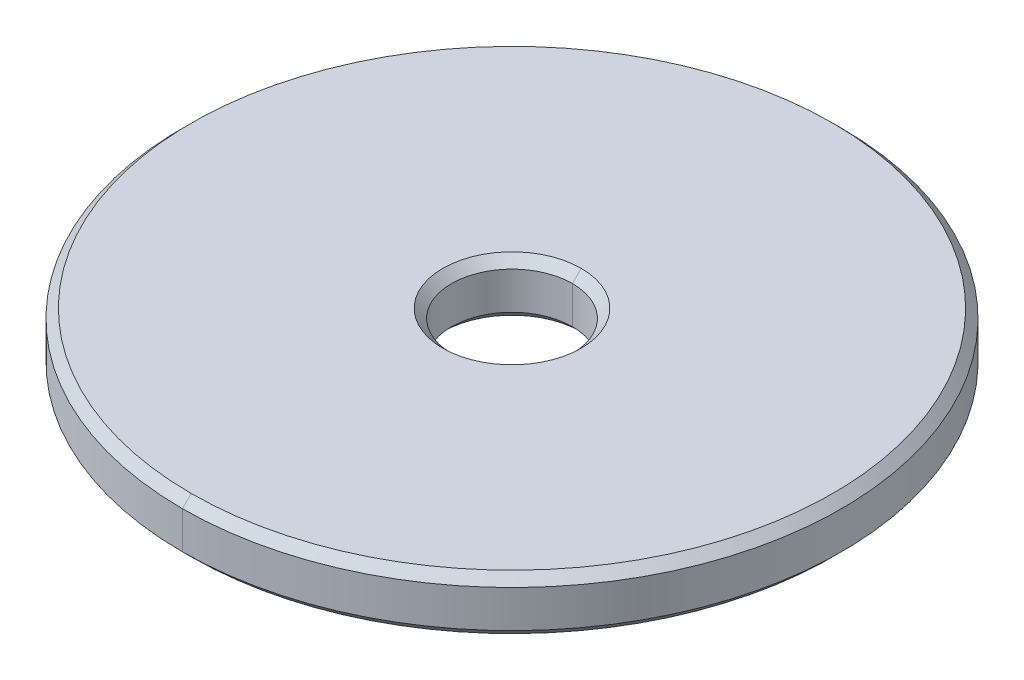
ISO-10303-21;
HEADER;
FILE_DESCRIPTION(('STEP AP214'),'2;1');
FILE_NAME('part.step','',(''),(''),'','','');
FILE_SCHEMA(('AUTOMOTIVE_DESIGN { 1 0 10303 214 1 1 1 1 }'));
ENDSEC;
DATA;
#1=APPLICATION_CONTEXT('core data for automotive mechanical design processes');
#2=APPLICATION_PROTOCOL_DEFINITION('international standard','automotive_design',2000,#1);
#3=PRODUCT_CONTEXT('',#1,'mechanical');
#4=PRODUCT('Part','Part','',(#3));
#5=PRODUCT_RELATED_PRODUCT_CATEGORY('part','',(#4));
#6=PRODUCT_DEFINITION_FORMATION('','',#4);
#7=PRODUCT_DEFINITION_CONTEXT('part definition',#1,'design');
#8=PRODUCT_DEFINITION('design','',#6,#7);
#9=PRODUCT_DEFINITION_SHAPE('','',#8);
#10=(LENGTH_UNIT() NAMED_UNIT(*) SI_UNIT(.MILLI.,.METRE.));
#11=(NAMED_UNIT(*) PLANE_ANGLE_UNIT() SI_UNIT($,.RADIAN.));
#12=(NAMED_UNIT(*) SI_UNIT($,.STERADIAN.) SOLID_ANGLE_UNIT());
#13=UNCERTAINTY_MEASURE_WITH_UNIT(LENGTH_MEASURE(1.E-05),#10,'distance_accuracy_value','');
#14=(GEOMETRIC_REPRESENTATION_CONTEXT(3) GLOBAL_UNCERTAINTY_ASSIGNED_CONTEXT((#13)) GLOBAL_UNIT_ASSIGNED_CONTEXT((#10,
#11,#12)) REPRESENTATION_CONTEXT('',''));
#15=CARTESIAN_POINT('',(0.,0.,0.));
#16=DIRECTION('',(0.,0.,1.));
#17=DIRECTION('',(1.,0.,0.));
#18=AXIS2_PLACEMENT_3D('',#15,#16,#17);
#19=CARTESIAN_POINT('',(0.,2.62120069378255,0.));
#20=DIRECTION('',(0.,1.,0.));
#21=DIRECTION('',(0.,0.,1.));
#22=AXIS2_PLACEMENT_3D('',#19,#20,#21);
#23=CONICAL_SURFACE('',#22,3.44670069378255,0.78539816339745);
#24=CARTESIAN_POINT('',(0.,2.667,0.));
#25=DIRECTION('',(0.,-1.,0.));
#26=DIRECTION('',(0.,0.,-1.));
#27=AXIS2_PLACEMENT_3D('',#24,#25,#26);
#28=CIRCLE('',#27,3.4925);
#29=CARTESIAN_POINT('',(0.,2.667,-3.4925));
#30=VERTEX_POINT('',#29);
#31=CARTESIAN_POINT('',(0.,2.667,3.4925));
#32=VERTEX_POINT('',#31);
#33=EDGE_CURVE('E20',#30,#32,#28,.T.);
#34=ORIENTED_EDGE('',*,*,#33,.T.);
#35=DIRECTION('',(0.,-0.707106781186546,-0.707106781186549));
#36=VECTOR('',#35,1.);
#37=CARTESIAN_POINT('',(0.,3.175,4.0005));
#38=LINE('',#37,#36);
#39=CARTESIAN_POINT('',(0.,3.175,4.0005));
#40=VERTEX_POINT('',#39);
#41=EDGE_CURVE('E128',#40,#32,#38,.T.);
#42=ORIENTED_EDGE('',*,*,#41,.F.);
#43=CARTESIAN_POINT('',(0.,3.175,0.));
#44=DIRECTION('',(0.,-1.,0.));
#45=DIRECTION('',(0.,0.,-1.));
#46=AXIS2_PLACEMENT_3D('',#43,#44,#45);
#47=CIRCLE('',#46,4.0005);
#48=CARTESIAN_POINT('',(0.,3.175,-4.0005));
#49=VERTEX_POINT('',#48);
#50=EDGE_CURVE('E118',#49,#40,#47,.T.);
#51=ORIENTED_EDGE('',*,*,#50,.F.);
#52=DIRECTION('',(0.,-0.707106781186546,0.707106781186549));
#53=VECTOR('',#52,1.);
#54=CARTESIAN_POINT('',(0.,3.175,-4.0005));
#55=LINE('',#54,#53);
#56=EDGE_CURVE('E132',#49,#30,#55,.T.);
#57=ORIENTED_EDGE('',*,*,#56,.T.);
#58=EDGE_LOOP('',(#34,#42,#51,#57));
#59=FACE_BOUND('',#58,.T.);
#60=ADVANCED_FACE('F17',(#59),#23,.F.);
#61=CARTESIAN_POINT('',(0.,-0.0457993062174637,0.));
#62=DIRECTION('',(0.,1.,0.));
#63=DIRECTION('',(0.,0.,1.));
#64=AXIS2_PLACEMENT_3D('',#61,#62,#63);
#65=CONICAL_SURFACE('',#64,18.4962006937825,0.785398163397452);
#66=DIRECTION('',(0.,-0.707106781186545,0.70710678118655));
#67=VECTOR('',#66,1.);
#68=CARTESIAN_POINT('',(0.,0.508000000000008,-19.05));
#69=LINE('',#68,#67);
#70=CARTESIAN_POINT('',(0.,0.508000000000003,-19.05));
#71=VERTEX_POINT('',#70);
#72=CARTESIAN_POINT('',(0.,0.,-18.542));
#73=VERTEX_POINT('',#72);
#74=EDGE_CURVE('E26',#71,#73,#69,.T.);
#75=ORIENTED_EDGE('',*,*,#74,.F.);
#76=CARTESIAN_POINT('',(0.,0.508000000000019,0.));
#77=DIRECTION('',(0.,-1.,0.));
#78=DIRECTION('',(0.,0.,-1.));
#79=AXIS2_PLACEMENT_3D('',#76,#77,#78);
#80=CIRCLE('',#79,19.05);
#81=CARTESIAN_POINT('',(0.,0.508000000000003,19.05));
#82=VERTEX_POINT('',#81);
#83=EDGE_CURVE('E33',#71,#82,#80,.T.);
#84=ORIENTED_EDGE('',*,*,#83,.T.);
#85=DIRECTION('',(0.,-0.707106781186545,-0.70710678118655));
#86=VECTOR('',#85,1.);
#87=CARTESIAN_POINT('',(0.,0.508000000000008,19.05));
#88=LINE('',#87,#86);
#89=CARTESIAN_POINT('',(0.,0.,18.542));
#90=VERTEX_POINT('',#89);
#91=EDGE_CURVE('E11',#82,#90,#88,.T.);
#92=ORIENTED_EDGE('',*,*,#91,.T.);
#93=CARTESIAN_POINT('',(0.,0.,0.));
#94=DIRECTION('',(0.,-1.,0.));
#95=DIRECTION('',(0.,0.,-1.));
#96=AXIS2_PLACEMENT_3D('',#93,#94,#95);
#97=CIRCLE('',#96,18.542);
#98=EDGE_CURVE('E161',#73,#90,#97,.T.);
#99=ORIENTED_EDGE('',*,*,#98,.F.);
#100=EDGE_LOOP('',(#75,#84,#92,#99));
#101=FACE_BOUND('',#100,.T.);
#102=ADVANCED_FACE('F206',(#101),#65,.T.);
#103=CARTESIAN_POINT('',(0.,-0.0457993062174637,0.));
#104=DIRECTION('',(0.,1.,0.));
#105=DIRECTION('',(0.,0.,1.));
#106=AXIS2_PLACEMENT_3D('',#103,#104,#105);
#107=CONICAL_SURFACE('',#106,18.4962006937825,0.785398163397452);
#108=CARTESIAN_POINT('',(0.,0.,0.));
#109=DIRECTION('',(0.,-1.,0.));
#110=DIRECTION('',(0.,0.,1.));
#111=AXIS2_PLACEMENT_3D('',#108,#109,#110);
#112=CIRCLE('',#111,18.542);
#113=EDGE_CURVE('E157',#90,#73,#112,.T.);
#114=ORIENTED_EDGE('',*,*,#113,.F.);
#115=ORIENTED_EDGE('',*,*,#91,.F.);
#116=CARTESIAN_POINT('',(0.,0.508000000000019,0.));
#117=DIRECTION('',(0.,-1.,0.));
#118=DIRECTION('',(0.,0.,1.));
#119=AXIS2_PLACEMENT_3D('',#116,#117,#118);
#120=CIRCLE('',#119,19.05);
#121=EDGE_CURVE('E171',#82,#71,#120,.T.);
#122=ORIENTED_EDGE('',*,*,#121,.T.);
#123=ORIENTED_EDGE('',*,*,#74,.T.);
#124=EDGE_LOOP('',(#114,#115,#122,#123));
#125=FACE_BOUND('',#124,.T.);
#126=ADVANCED_FACE('F210',(#125),#107,.T.);
#127=CARTESIAN_POINT('',(0.,0.,0.));
#128=DIRECTION('',(0.,1.,0.));
#129=DIRECTION('',(0.,0.,1.));
#130=AXIS2_PLACEMENT_3D('',#127,#128,#129);
#131=PLANE('',#130);
#132=CARTESIAN_POINT('',(0.,0.,0.));
#133=DIRECTION('',(0.,1.,0.));
#134=DIRECTION('',(0.,0.,1.));
#135=AXIS2_PLACEMENT_3D('',#132,#133,#134);
#136=CIRCLE('',#135,4.0005);
#137=CARTESIAN_POINT('',(0.,0.,4.0005));
#138=VERTEX_POINT('',#137);
#139=CARTESIAN_POINT('',(0.,0.,-4.0005));
#140=VERTEX_POINT('',#139);
#141=EDGE_CURVE('E147',#138,#140,#136,.T.);
#142=ORIENTED_EDGE('',*,*,#141,.T.);
#143=CARTESIAN_POINT('',(0.,0.,0.));
#144=DIRECTION('',(0.,1.,0.));
#145=DIRECTION('',(0.,0.,-1.));
#146=AXIS2_PLACEMENT_3D('',#143,#144,#145);
#147=CIRCLE('',#146,4.0005);
#148=EDGE_CURVE('E156',#140,#138,#147,.T.);
#149=ORIENTED_EDGE('',*,*,#148,.T.);
#150=EDGE_LOOP('',(#142,#149));
#151=FACE_BOUND('',#150,.T.);
#152=ORIENTED_EDGE('',*,*,#98,.T.);
#153=ORIENTED_EDGE('',*,*,#113,.T.);
#154=EDGE_LOOP('',(#152,#153));
#155=FACE_BOUND('',#154,.T.);
#156=ADVANCED_FACE('F214',(#151,#155),#131,.F.);
#157=CARTESIAN_POINT('',(0.,0.553799306217448,0.));
#158=DIRECTION('',(0.,-1.,0.));
#159=DIRECTION('',(0.,0.,-1.));
#160=AXIS2_PLACEMENT_3D('',#157,#158,#159);
#161=CONICAL_SURFACE('',#160,3.44670069378255,0.785398163397454);
#162=DIRECTION('',(0.,0.707106781186544,-0.707106781186551));
#163=VECTOR('',#162,1.);
#164=CARTESIAN_POINT('',(0.,0.,4.0005));
#165=LINE('',#164,#163);
#166=CARTESIAN_POINT('',(0.,0.507999999999998,3.4925));
#167=VERTEX_POINT('',#166);
#168=EDGE_CURVE('E143',#138,#167,#165,.T.);
#169=ORIENTED_EDGE('',*,*,#168,.F.);
#170=ORIENTED_EDGE('',*,*,#148,.F.);
#171=DIRECTION('',(0.,0.707106781186544,0.707106781186551));
#172=VECTOR('',#171,1.);
#173=CARTESIAN_POINT('',(0.,0.,-4.0005));
#174=LINE('',#173,#172);
#175=CARTESIAN_POINT('',(0.,0.507999999999998,-3.4925));
#176=VERTEX_POINT('',#175);
#177=EDGE_CURVE('E153',#140,#176,#174,.T.);
#178=ORIENTED_EDGE('',*,*,#177,.T.);
#179=CARTESIAN_POINT('',(0.,0.507999999999995,0.));
#180=DIRECTION('',(0.,1.,0.));
#181=DIRECTION('',(0.,0.,-1.));
#182=AXIS2_PLACEMENT_3D('',#179,#180,#181);
#183=CIRCLE('',#182,3.4925);
#184=EDGE_CURVE('E137',#176,#167,#183,.T.);
#185=ORIENTED_EDGE('',*,*,#184,.T.);
#186=EDGE_LOOP('',(#169,#170,#178,#185));
#187=FACE_BOUND('',#186,.T.);
#188=ADVANCED_FACE('F220',(#187),#161,.F.);
#189=CARTESIAN_POINT('',(0.,0.553799306217448,0.));
#190=DIRECTION('',(0.,-1.,0.));
#191=DIRECTION('',(0.,0.,-1.));
#192=AXIS2_PLACEMENT_3D('',#189,#190,#191);
#193=CONICAL_SURFACE('',#192,3.44670069378255,0.785398163397454);
#194=CARTESIAN_POINT('',(0.,0.507999999999995,0.));
#195=DIRECTION('',(0.,1.,0.));
#196=DIRECTION('',(0.,0.,1.));
#197=AXIS2_PLACEMENT_3D('',#194,#195,#196);
#198=CIRCLE('',#197,3.4925);
#199=EDGE_CURVE('E142',#167,#176,#198,.T.);
#200=ORIENTED_EDGE('',*,*,#199,.T.);
#201=ORIENTED_EDGE('',*,*,#177,.F.);
#202=ORIENTED_EDGE('',*,*,#141,.F.);
#203=ORIENTED_EDGE('',*,*,#168,.T.);
#204=EDGE_LOOP('',(#200,#201,#202,#203));
#205=FACE_BOUND('',#204,.T.);
#206=ADVANCED_FACE('F224',(#205),#193,.F.);
#207=CARTESIAN_POINT('',(0.,3.175,0.));
#208=DIRECTION('',(0.,-1.,0.));
#209=DIRECTION('',(0.,0.,-1.));
#210=AXIS2_PLACEMENT_3D('',#207,#208,#209);
#211=CYLINDRICAL_SURFACE('',#210,3.4925);
#212=ORIENTED_EDGE('',*,*,#33,.F.);
#213=DIRECTION('',(0.,1.,0.));
#214=VECTOR('',#213,1.);
#215=CARTESIAN_POINT('',(0.,0.508,-3.4925));
#216=LINE('',#215,#214);
#217=EDGE_CURVE('E133',#176,#30,#216,.T.);
#218=ORIENTED_EDGE('',*,*,#217,.F.);
#219=ORIENTED_EDGE('',*,*,#199,.F.);
#220=DIRECTION('',(0.,1.,0.));
#221=VECTOR('',#220,1.);
#222=CARTESIAN_POINT('',(0.,0.508,3.4925));
#223=LINE('',#222,#221);
#224=EDGE_CURVE('E138',#167,#32,#223,.T.);
#225=ORIENTED_EDGE('',*,*,#224,.T.);
#226=EDGE_LOOP('',(#212,#218,#219,#225));
#227=FACE_BOUND('',#226,.T.);
#228=ADVANCED_FACE('F185',(#227),#211,.F.);
#229=CARTESIAN_POINT('',(0.,3.175,0.));
#230=DIRECTION('',(0.,-1.,0.));
#231=DIRECTION('',(0.,0.,-1.));
#232=AXIS2_PLACEMENT_3D('',#229,#230,#231);
#233=CYLINDRICAL_SURFACE('',#232,3.4925);
#234=ORIENTED_EDGE('',*,*,#224,.F.);
#235=ORIENTED_EDGE('',*,*,#184,.F.);
#236=ORIENTED_EDGE('',*,*,#217,.T.);
#237=CARTESIAN_POINT('',(0.,2.667,0.));
#238=DIRECTION('',(0.,-1.,0.));
#239=DIRECTION('',(0.,0.,1.));
#240=AXIS2_PLACEMENT_3D('',#237,#238,#239);
#241=CIRCLE('',#240,3.4925);
#242=EDGE_CURVE('E121',#32,#30,#241,.T.);
#243=ORIENTED_EDGE('',*,*,#242,.F.);
#244=EDGE_LOOP('',(#234,#235,#236,#243));
#245=FACE_BOUND('',#244,.T.);
#246=ADVANCED_FACE('F192',(#245),#233,.F.);
#247=CARTESIAN_POINT('',(0.,2.62120069378255,0.));
#248=DIRECTION('',(0.,1.,0.));
#249=DIRECTION('',(0.,0.,1.));
#250=AXIS2_PLACEMENT_3D('',#247,#248,#249);
#251=CONICAL_SURFACE('',#250,3.44670069378255,0.78539816339745);
#252=ORIENTED_EDGE('',*,*,#56,.F.);
#253=CARTESIAN_POINT('',(0.,3.175,0.));
#254=DIRECTION('',(0.,-1.,0.));
#255=DIRECTION('',(0.,0.,1.));
#256=AXIS2_PLACEMENT_3D('',#253,#254,#255);
#257=CIRCLE('',#256,4.0005);
#258=EDGE_CURVE('E91',#40,#49,#257,.T.);
#259=ORIENTED_EDGE('',*,*,#258,.F.);
#260=ORIENTED_EDGE('',*,*,#41,.T.);
#261=ORIENTED_EDGE('',*,*,#242,.T.);
#262=EDGE_LOOP('',(#252,#259,#260,#261));
#263=FACE_BOUND('',#262,.T.);
#264=ADVANCED_FACE('F193',(#263),#251,.F.);
#265=CARTESIAN_POINT('',(0.,3.22079930621748,0.));
#266=DIRECTION('',(0.,-1.,0.));
#267=DIRECTION('',(0.,0.,-1.));
#268=AXIS2_PLACEMENT_3D('',#265,#266,#267);
#269=CONICAL_SURFACE('',#268,18.4962006937825,0.785398163397445);
#270=CARTESIAN_POINT('',(0.,3.17500000000003,0.));
#271=DIRECTION('',(0.,1.,0.));
#272=DIRECTION('',(0.,0.,-1.));
#273=AXIS2_PLACEMENT_3D('',#270,#271,#272);
#274=CIRCLE('',#273,18.542);
#275=CARTESIAN_POINT('',(0.,3.17500000000001,-18.542));
#276=VERTEX_POINT('',#275);
#277=CARTESIAN_POINT('',(0.,3.17500000000001,18.542));
#278=VERTEX_POINT('',#277);
#279=EDGE_CURVE('E80',#276,#278,#274,.T.);
#280=ORIENTED_EDGE('',*,*,#279,.F.);
#281=DIRECTION('',(0.,0.70710678118655,0.707106781186545));
#282=VECTOR('',#281,1.);
#283=CARTESIAN_POINT('',(0.,2.66699999999999,-19.05));
#284=LINE('',#283,#282);
#285=CARTESIAN_POINT('',(0.,2.66699999999999,-19.05));
#286=VERTEX_POINT('',#285);
#287=EDGE_CURVE('E84',#286,#276,#284,.T.);
#288=ORIENTED_EDGE('',*,*,#287,.F.);
#289=CARTESIAN_POINT('',(0.,2.66699999999997,0.));
#290=DIRECTION('',(0.,1.,0.));
#291=DIRECTION('',(0.,0.,-1.));
#292=AXIS2_PLACEMENT_3D('',#289,#290,#291);
#293=CIRCLE('',#292,19.05);
#294=CARTESIAN_POINT('',(0.,2.66699999999999,19.05));
#295=VERTEX_POINT('',#294);
#296=EDGE_CURVE('E113',#286,#295,#293,.T.);
#297=ORIENTED_EDGE('',*,*,#296,.T.);
#298=DIRECTION('',(0.,0.70710678118655,-0.707106781186545));
#299=VECTOR('',#298,1.);
#300=CARTESIAN_POINT('',(0.,2.66699999999998,19.05));
#301=LINE('',#300,#299);
#302=EDGE_CURVE('E87',#295,#278,#301,.T.);
#303=ORIENTED_EDGE('',*,*,#302,.T.);
#304=EDGE_LOOP('',(#280,#288,#297,#303));
#305=FACE_BOUND('',#304,.T.);
#306=ADVANCED_FACE('F82',(#305),#269,.T.);
#307=CARTESIAN_POINT('',(0.,3.175,0.));
#308=DIRECTION('',(0.,1.,0.));
#309=DIRECTION('',(0.,0.,1.));
#310=AXIS2_PLACEMENT_3D('',#307,#308,#309);
#311=PLANE('',#310);
#312=ORIENTED_EDGE('',*,*,#50,.T.);
#313=ORIENTED_EDGE('',*,*,#258,.T.);
#314=EDGE_LOOP('',(#312,#313));
#315=FACE_BOUND('',#314,.T.);
#316=CARTESIAN_POINT('',(0.,3.17500000000003,0.));
#317=DIRECTION('',(0.,1.,0.));
#318=DIRECTION('',(0.,0.,1.));
#319=AXIS2_PLACEMENT_3D('',#316,#317,#318);
#320=CIRCLE('',#319,18.542);
#321=EDGE_CURVE('E93',#278,#276,#320,.T.);
#322=ORIENTED_EDGE('',*,*,#321,.T.);
#323=ORIENTED_EDGE('',*,*,#279,.T.);
#324=EDGE_LOOP('',(#322,#323));
#325=FACE_BOUND('',#324,.T.);
#326=ADVANCED_FACE('F94',(#315,#325),#311,.T.);
#327=CARTESIAN_POINT('',(0.,3.22079930621748,0.));
#328=DIRECTION('',(0.,-1.,0.));
#329=DIRECTION('',(0.,0.,-1.));
#330=AXIS2_PLACEMENT_3D('',#327,#328,#329);
#331=CONICAL_SURFACE('',#330,18.4962006937825,0.785398163397445);
#332=ORIENTED_EDGE('',*,*,#302,.F.);
#333=CARTESIAN_POINT('',(0.,2.667,0.));
#334=DIRECTION('',(0.,1.,0.));
#335=DIRECTION('',(0.,0.,1.));
#336=AXIS2_PLACEMENT_3D('',#333,#334,#335);
#337=CIRCLE('',#336,19.05);
#338=EDGE_CURVE('E100',#295,#286,#337,.T.);
#339=ORIENTED_EDGE('',*,*,#338,.T.);
#340=ORIENTED_EDGE('',*,*,#287,.T.);
#341=ORIENTED_EDGE('',*,*,#321,.F.);
#342=EDGE_LOOP('',(#332,#339,#340,#341));
#343=FACE_BOUND('',#342,.T.);
#344=ADVANCED_FACE('F98',(#343),#331,.T.);
#345=CARTESIAN_POINT('',(0.,3.175,0.));
#346=DIRECTION('',(0.,-1.,0.));
#347=DIRECTION('',(0.,0.,-1.));
#348=AXIS2_PLACEMENT_3D('',#345,#346,#347);
#349=CYLINDRICAL_SURFACE('',#348,19.05);
#350=DIRECTION('',(0.,1.,0.));
#351=VECTOR('',#350,1.);
#352=CARTESIAN_POINT('',(0.,0.507999999999998,19.05));
#353=LINE('',#352,#351);
#354=EDGE_CURVE('E173',#82,#295,#353,.T.);
#355=ORIENTED_EDGE('',*,*,#354,.F.);
#356=ORIENTED_EDGE('',*,*,#83,.F.);
#357=DIRECTION('',(0.,1.,0.));
#358=VECTOR('',#357,1.);
#359=CARTESIAN_POINT('',(0.,0.507999999999998,-19.05));
#360=LINE('',#359,#358);
#361=EDGE_CURVE('E110',#71,#286,#360,.T.);
#362=ORIENTED_EDGE('',*,*,#361,.T.);
#363=ORIENTED_EDGE('',*,*,#338,.F.);
#364=EDGE_LOOP('',(#355,#356,#362,#363));
#365=FACE_BOUND('',#364,.T.);
#366=ADVANCED_FACE('F202',(#365),#349,.T.);
#367=CARTESIAN_POINT('',(0.,3.175,0.));
#368=DIRECTION('',(0.,-1.,0.));
#369=DIRECTION('',(0.,0.,-1.));
#370=AXIS2_PLACEMENT_3D('',#367,#368,#369);
#371=CYLINDRICAL_SURFACE('',#370,19.05);
#372=ORIENTED_EDGE('',*,*,#296,.F.);
#373=ORIENTED_EDGE('',*,*,#361,.F.);
#374=ORIENTED_EDGE('',*,*,#121,.F.);
#375=ORIENTED_EDGE('',*,*,#354,.T.);
#376=EDGE_LOOP('',(#372,#373,#374,#375));
#377=FACE_BOUND('',#376,.T.);
#378=ADVANCED_FACE('F266',(#377),#371,.T.);
#379=CLOSED_SHELL('',(#60,#102,#126,#156,#188,#206,#228,#246,#264,#306,#326,#344,#366,#378));
#380=MANIFOLD_SOLID_BREP('B1',#379);
#381=ADVANCED_BREP_SHAPE_REPRESENTATION('',(#18,#380),#14);
#382=SHAPE_DEFINITION_REPRESENTATION(#9,#381);
ENDSEC;
END-ISO-10303-21;
